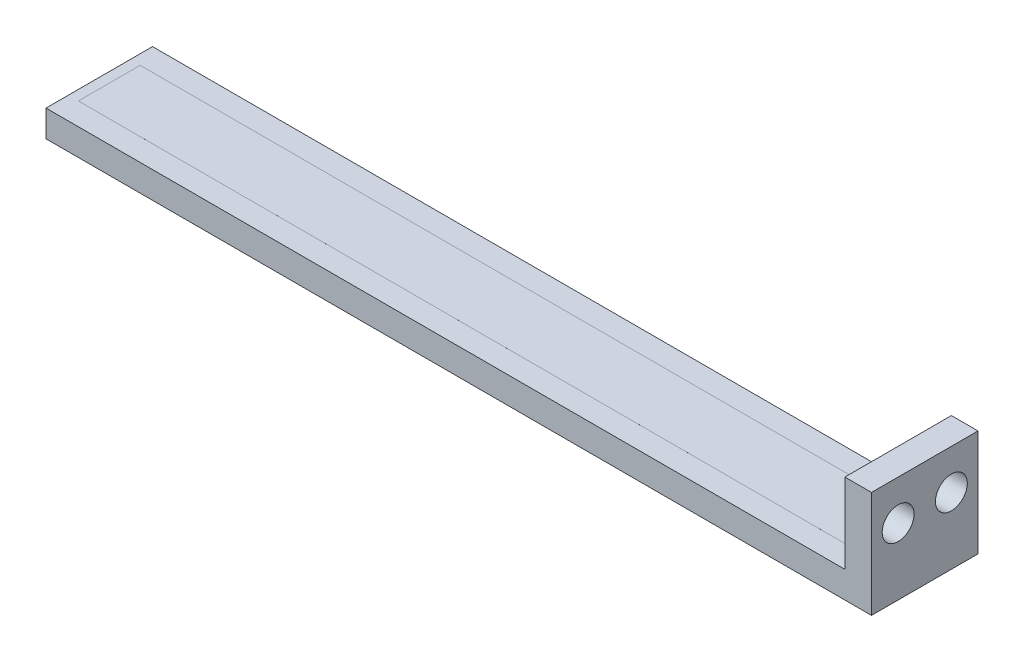
ISO-10303-21;
HEADER;
FILE_DESCRIPTION(('STEP AP214'),'2;1');
FILE_NAME('part.step','',(''),(''),'','','');
FILE_SCHEMA(('AUTOMOTIVE_DESIGN { 1 0 10303 214 1 1 1 1 }'));
ENDSEC;
DATA;
#1=APPLICATION_CONTEXT('core data for automotive mechanical design processes');
#2=APPLICATION_PROTOCOL_DEFINITION('international standard','automotive_design',2000,#1);
#3=PRODUCT_CONTEXT('',#1,'mechanical');
#4=PRODUCT('Part','Part','',(#3));
#5=PRODUCT_RELATED_PRODUCT_CATEGORY('part','',(#4));
#6=PRODUCT_DEFINITION_FORMATION('','',#4);
#7=PRODUCT_DEFINITION_CONTEXT('part definition',#1,'design');
#8=PRODUCT_DEFINITION('design','',#6,#7);
#9=PRODUCT_DEFINITION_SHAPE('','',#8);
#10=(LENGTH_UNIT() NAMED_UNIT(*) SI_UNIT(.MILLI.,.METRE.));
#11=(NAMED_UNIT(*) PLANE_ANGLE_UNIT() SI_UNIT($,.RADIAN.));
#12=(NAMED_UNIT(*) SI_UNIT($,.STERADIAN.) SOLID_ANGLE_UNIT());
#13=UNCERTAINTY_MEASURE_WITH_UNIT(LENGTH_MEASURE(1.E-05),#10,'distance_accuracy_value','');
#14=(GEOMETRIC_REPRESENTATION_CONTEXT(3) GLOBAL_UNCERTAINTY_ASSIGNED_CONTEXT((#13)) GLOBAL_UNIT_ASSIGNED_CONTEXT((#10,
#11,#12)) REPRESENTATION_CONTEXT('',''));
#15=CARTESIAN_POINT('',(0.,0.,0.));
#16=DIRECTION('',(0.,0.,1.));
#17=DIRECTION('',(1.,0.,0.));
#18=AXIS2_PLACEMENT_3D('',#15,#16,#17);
#19=CARTESIAN_POINT('',(0.,1.5875,12.7));
#20=DIRECTION('',(0.,-1.,0.));
#21=DIRECTION('',(1.,0.,0.));
#22=AXIS2_PLACEMENT_3D('',#19,#20,#21);
#23=PLANE('',#22);
#24=DIRECTION('',(-1.,0.,0.));
#25=VECTOR('',#24,1.);
#26=CARTESIAN_POINT('',(0.,1.5875,0.));
#27=LINE('',#26,#25);
#28=CARTESIAN_POINT('',(47.625,1.58750000000001,0.));
#29=VERTEX_POINT('',#28);
#30=CARTESIAN_POINT('',(-47.625,1.58749999999999,0.));
#31=VERTEX_POINT('',#30);
#32=EDGE_CURVE('E152',#29,#31,#27,.T.);
#33=ORIENTED_EDGE('',*,*,#32,.T.);
#34=DIRECTION('',(0.,0.,-1.));
#35=VECTOR('',#34,1.);
#36=CARTESIAN_POINT('',(-47.625,1.58749999999999,12.7));
#37=LINE('',#36,#35);
#38=CARTESIAN_POINT('',(-47.625,1.58749999999999,12.7));
#39=VERTEX_POINT('',#38);
#40=EDGE_CURVE('E165',#39,#31,#37,.T.);
#41=ORIENTED_EDGE('',*,*,#40,.F.);
#42=DIRECTION('',(-1.,0.,0.));
#43=VECTOR('',#42,1.);
#44=CARTESIAN_POINT('',(0.,1.5875,12.7));
#45=LINE('',#44,#43);
#46=CARTESIAN_POINT('',(47.625,1.58750000000001,12.7));
#47=VERTEX_POINT('',#46);
#48=EDGE_CURVE('E163',#47,#39,#45,.T.);
#49=ORIENTED_EDGE('',*,*,#48,.F.);
#50=DIRECTION('',(0.,0.,-1.));
#51=VECTOR('',#50,1.);
#52=CARTESIAN_POINT('',(47.625,1.58750000000001,12.7));
#53=LINE('',#52,#51);
#54=EDGE_CURVE('E183',#47,#29,#53,.T.);
#55=ORIENTED_EDGE('',*,*,#54,.T.);
#56=EDGE_LOOP('',(#33,#41,#49,#55));
#57=FACE_BOUND('',#56,.T.);
#58=DIRECTION('',(0.,0.,1.));
#59=VECTOR('',#58,1.);
#60=CARTESIAN_POINT('',(-46.4285533627469,1.58749999999999,10.0319032515552));
#61=LINE('',#60,#59);
#62=CARTESIAN_POINT('',(-46.4285533627469,1.58749999999999,2.66809674844484));
#63=VERTEX_POINT('',#62);
#64=CARTESIAN_POINT('',(-46.4285533627469,1.58749999999999,10.0319032515552));
#65=VERTEX_POINT('',#64);
#66=EDGE_CURVE('E129',#63,#65,#61,.T.);
#67=ORIENTED_EDGE('',*,*,#66,.F.);
#68=DIRECTION('',(-1.,0.,0.));
#69=VECTOR('',#68,1.);
#70=CARTESIAN_POINT('',(46.4285533627469,1.58750000000001,2.66809674844484));
#71=LINE('',#70,#69);
#72=CARTESIAN_POINT('',(46.4285533627469,1.58750000000001,2.66809674844484));
#73=VERTEX_POINT('',#72);
#74=EDGE_CURVE('E126',#73,#63,#71,.T.);
#75=ORIENTED_EDGE('',*,*,#74,.F.);
#76=DIRECTION('',(0.,0.,-1.));
#77=VECTOR('',#76,1.);
#78=CARTESIAN_POINT('',(46.4285533627469,1.58750000000001,10.0319032515552));
#79=LINE('',#78,#77);
#80=CARTESIAN_POINT('',(46.4285533627469,1.58750000000001,10.0319032515552));
#81=VERTEX_POINT('',#80);
#82=EDGE_CURVE('E53',#81,#73,#79,.T.);
#83=ORIENTED_EDGE('',*,*,#82,.F.);
#84=DIRECTION('',(1.,0.,0.));
#85=VECTOR('',#84,1.);
#86=CARTESIAN_POINT('',(46.4285533627469,1.58750000000001,10.0319032515552));
#87=LINE('',#86,#85);
#88=EDGE_CURVE('E48',#65,#81,#87,.T.);
#89=ORIENTED_EDGE('',*,*,#88,.F.);
#90=EDGE_LOOP('',(#67,#75,#83,#89));
#91=FACE_BOUND('',#90,.T.);
#92=ADVANCED_FACE('F33',(#57,#91),#23,.F.);
#93=CARTESIAN_POINT('',(-47.625,0.,12.7));
#94=DIRECTION('',(-1.,0.,0.));
#95=DIRECTION('',(0.,0.,1.));
#96=AXIS2_PLACEMENT_3D('',#93,#94,#95);
#97=PLANE('',#96);
#98=DIRECTION('',(0.,1.,0.));
#99=VECTOR('',#98,1.);
#100=CARTESIAN_POINT('',(-47.625,0.,0.));
#101=LINE('',#100,#99);
#102=CARTESIAN_POINT('',(-47.625,-1.58750000000001,0.));
#103=VERTEX_POINT('',#102);
#104=EDGE_CURVE('E147',#103,#31,#101,.T.);
#105=ORIENTED_EDGE('',*,*,#104,.F.);
#106=DIRECTION('',(0.,0.,-1.));
#107=VECTOR('',#106,1.);
#108=CARTESIAN_POINT('',(-47.625,-1.58750000000001,12.7));
#109=LINE('',#108,#107);
#110=CARTESIAN_POINT('',(-47.625,-1.58750000000001,12.7));
#111=VERTEX_POINT('',#110);
#112=EDGE_CURVE('E11',#111,#103,#109,.T.);
#113=ORIENTED_EDGE('',*,*,#112,.F.);
#114=DIRECTION('',(0.,1.,0.));
#115=VECTOR('',#114,1.);
#116=CARTESIAN_POINT('',(-47.625,0.,12.7));
#117=LINE('',#116,#115);
#118=EDGE_CURVE('E148',#111,#39,#117,.T.);
#119=ORIENTED_EDGE('',*,*,#118,.T.);
#120=ORIENTED_EDGE('',*,*,#40,.T.);
#121=EDGE_LOOP('',(#105,#113,#119,#120));
#122=FACE_BOUND('',#121,.T.);
#123=ADVANCED_FACE('F35',(#122),#97,.T.);
#124=CARTESIAN_POINT('',(0.,-1.5875,12.7));
#125=DIRECTION('',(0.,-1.,0.));
#126=DIRECTION('',(1.,0.,0.));
#127=AXIS2_PLACEMENT_3D('',#124,#125,#126);
#128=PLANE('',#127);
#129=DIRECTION('',(-1.,0.,0.));
#130=VECTOR('',#129,1.);
#131=CARTESIAN_POINT('',(0.,-1.5875,0.));
#132=LINE('',#131,#130);
#133=CARTESIAN_POINT('',(50.8,-1.58749999999999,0.));
#134=VERTEX_POINT('',#133);
#135=EDGE_CURVE('E168',#134,#103,#132,.T.);
#136=ORIENTED_EDGE('',*,*,#135,.F.);
#137=DIRECTION('',(0.,0.,-1.));
#138=VECTOR('',#137,1.);
#139=CARTESIAN_POINT('',(50.8,-1.58749999999999,12.7));
#140=LINE('',#139,#138);
#141=CARTESIAN_POINT('',(50.8,-1.58749999999999,12.7));
#142=VERTEX_POINT('',#141);
#143=EDGE_CURVE('E41',#142,#134,#140,.T.);
#144=ORIENTED_EDGE('',*,*,#143,.F.);
#145=DIRECTION('',(-1.,0.,0.));
#146=VECTOR('',#145,1.);
#147=CARTESIAN_POINT('',(0.,-1.5875,12.7));
#148=LINE('',#147,#146);
#149=EDGE_CURVE('E151',#142,#111,#148,.T.);
#150=ORIENTED_EDGE('',*,*,#149,.T.);
#151=ORIENTED_EDGE('',*,*,#112,.T.);
#152=EDGE_LOOP('',(#136,#144,#150,#151));
#153=FACE_BOUND('',#152,.T.);
#154=ADVANCED_FACE('F199',(#153),#128,.T.);
#155=CARTESIAN_POINT('',(50.8,0.,12.7));
#156=DIRECTION('',(-1.,0.,0.));
#157=DIRECTION('',(0.,0.,1.));
#158=AXIS2_PLACEMENT_3D('',#155,#156,#157);
#159=PLANE('',#158);
#160=CARTESIAN_POINT('',(50.8,6.35000000000001,9.525));
#161=DIRECTION('',(-1.,0.,0.));
#162=DIRECTION('',(0.,0.,1.));
#163=AXIS2_PLACEMENT_3D('',#160,#161,#162);
#164=CIRCLE('',#163,1.89865);
#165=CARTESIAN_POINT('',(50.8,6.35000000000001,11.42365));
#166=VERTEX_POINT('',#165);
#167=EDGE_CURVE('E133',#166,#166,#164,.T.);
#168=ORIENTED_EDGE('',*,*,#167,.T.);
#169=EDGE_LOOP('',(#168));
#170=FACE_BOUND('',#169,.T.);
#171=CARTESIAN_POINT('',(50.8,6.35000000000001,3.175));
#172=DIRECTION('',(-1.,0.,0.));
#173=DIRECTION('',(0.,0.,1.));
#174=AXIS2_PLACEMENT_3D('',#171,#172,#173);
#175=CIRCLE('',#174,1.89865);
#176=CARTESIAN_POINT('',(50.8,6.35000000000001,5.07365));
#177=VERTEX_POINT('',#176);
#178=EDGE_CURVE('E144',#177,#177,#175,.T.);
#179=ORIENTED_EDGE('',*,*,#178,.T.);
#180=EDGE_LOOP('',(#179));
#181=FACE_BOUND('',#180,.T.);
#182=DIRECTION('',(0.,1.,0.));
#183=VECTOR('',#182,1.);
#184=CARTESIAN_POINT('',(50.8,0.,0.));
#185=LINE('',#184,#183);
#186=CARTESIAN_POINT('',(50.8,11.1125,0.));
#187=VERTEX_POINT('',#186);
#188=EDGE_CURVE('E171',#134,#187,#185,.T.);
#189=ORIENTED_EDGE('',*,*,#188,.T.);
#190=DIRECTION('',(0.,0.,-1.));
#191=VECTOR('',#190,1.);
#192=CARTESIAN_POINT('',(50.8,11.1125,12.7));
#193=LINE('',#192,#191);
#194=CARTESIAN_POINT('',(50.8,11.1125,12.7));
#195=VERTEX_POINT('',#194);
#196=EDGE_CURVE('E187',#195,#187,#193,.T.);
#197=ORIENTED_EDGE('',*,*,#196,.F.);
#198=DIRECTION('',(0.,1.,0.));
#199=VECTOR('',#198,1.);
#200=CARTESIAN_POINT('',(50.8,0.,12.7));
#201=LINE('',#200,#199);
#202=EDGE_CURVE('E155',#142,#195,#201,.T.);
#203=ORIENTED_EDGE('',*,*,#202,.F.);
#204=ORIENTED_EDGE('',*,*,#143,.T.);
#205=EDGE_LOOP('',(#189,#197,#203,#204));
#206=FACE_BOUND('',#205,.T.);
#207=ADVANCED_FACE('F191',(#170,#181,#206),#159,.F.);
#208=CARTESIAN_POINT('',(0.,11.1125,12.7));
#209=DIRECTION('',(0.,1.,0.));
#210=DIRECTION('',(0.,0.,1.));
#211=AXIS2_PLACEMENT_3D('',#208,#209,#210);
#212=PLANE('',#211);
#213=DIRECTION('',(1.,0.,0.));
#214=VECTOR('',#213,1.);
#215=CARTESIAN_POINT('',(0.,11.1125,0.));
#216=LINE('',#215,#214);
#217=CARTESIAN_POINT('',(47.625,11.1125,0.));
#218=VERTEX_POINT('',#217);
#219=EDGE_CURVE('E174',#218,#187,#216,.T.);
#220=ORIENTED_EDGE('',*,*,#219,.F.);
#221=DIRECTION('',(0.,0.,-1.));
#222=VECTOR('',#221,1.);
#223=CARTESIAN_POINT('',(47.625,11.1125,12.7));
#224=LINE('',#223,#222);
#225=CARTESIAN_POINT('',(47.625,11.1125,12.7));
#226=VERTEX_POINT('',#225);
#227=EDGE_CURVE('E185',#226,#218,#224,.T.);
#228=ORIENTED_EDGE('',*,*,#227,.F.);
#229=DIRECTION('',(1.,0.,0.));
#230=VECTOR('',#229,1.);
#231=CARTESIAN_POINT('',(0.,11.1125,12.7));
#232=LINE('',#231,#230);
#233=EDGE_CURVE('E157',#226,#195,#232,.T.);
#234=ORIENTED_EDGE('',*,*,#233,.T.);
#235=ORIENTED_EDGE('',*,*,#196,.T.);
#236=EDGE_LOOP('',(#220,#228,#234,#235));
#237=FACE_BOUND('',#236,.T.);
#238=ADVANCED_FACE('F213',(#237),#212,.T.);
#239=CARTESIAN_POINT('',(47.625,0.,12.7));
#240=DIRECTION('',(-1.,0.,0.));
#241=DIRECTION('',(0.,0.,1.));
#242=AXIS2_PLACEMENT_3D('',#239,#240,#241);
#243=PLANE('',#242);
#244=CARTESIAN_POINT('',(47.625,6.35000000000001,9.525));
#245=DIRECTION('',(-1.,0.,0.));
#246=DIRECTION('',(0.,0.,1.));
#247=AXIS2_PLACEMENT_3D('',#244,#245,#246);
#248=CIRCLE('',#247,1.89865);
#249=CARTESIAN_POINT('',(47.625,6.35000000000001,11.42365));
#250=VERTEX_POINT('',#249);
#251=EDGE_CURVE('E130',#250,#250,#248,.T.);
#252=ORIENTED_EDGE('',*,*,#251,.F.);
#253=EDGE_LOOP('',(#252));
#254=FACE_BOUND('',#253,.T.);
#255=CARTESIAN_POINT('',(47.625,6.35000000000001,3.175));
#256=DIRECTION('',(-1.,0.,0.));
#257=DIRECTION('',(0.,0.,1.));
#258=AXIS2_PLACEMENT_3D('',#255,#256,#257);
#259=CIRCLE('',#258,1.89865);
#260=CARTESIAN_POINT('',(47.625,6.35000000000001,5.07365));
#261=VERTEX_POINT('',#260);
#262=EDGE_CURVE('E141',#261,#261,#259,.T.);
#263=ORIENTED_EDGE('',*,*,#262,.F.);
#264=EDGE_LOOP('',(#263));
#265=FACE_BOUND('',#264,.T.);
#266=DIRECTION('',(0.,1.,0.));
#267=VECTOR('',#266,1.);
#268=CARTESIAN_POINT('',(47.625,0.,0.));
#269=LINE('',#268,#267);
#270=EDGE_CURVE('E177',#29,#218,#269,.T.);
#271=ORIENTED_EDGE('',*,*,#270,.F.);
#272=ORIENTED_EDGE('',*,*,#54,.F.);
#273=DIRECTION('',(0.,1.,0.));
#274=VECTOR('',#273,1.);
#275=CARTESIAN_POINT('',(47.625,0.,12.7));
#276=LINE('',#275,#274);
#277=EDGE_CURVE('E160',#47,#226,#276,.T.);
#278=ORIENTED_EDGE('',*,*,#277,.T.);
#279=ORIENTED_EDGE('',*,*,#227,.T.);
#280=EDGE_LOOP('',(#271,#272,#278,#279));
#281=FACE_BOUND('',#280,.T.);
#282=ADVANCED_FACE('F208',(#254,#265,#281),#243,.T.);
#283=CARTESIAN_POINT('',(0.,0.,12.7));
#284=DIRECTION('',(0.,0.,1.));
#285=DIRECTION('',(1.,0.,0.));
#286=AXIS2_PLACEMENT_3D('',#283,#284,#285);
#287=PLANE('',#286);
#288=ORIENTED_EDGE('',*,*,#118,.F.);
#289=ORIENTED_EDGE('',*,*,#149,.F.);
#290=ORIENTED_EDGE('',*,*,#202,.T.);
#291=ORIENTED_EDGE('',*,*,#233,.F.);
#292=ORIENTED_EDGE('',*,*,#277,.F.);
#293=ORIENTED_EDGE('',*,*,#48,.T.);
#294=EDGE_LOOP('',(#288,#289,#290,#291,#292,#293));
#295=FACE_BOUND('',#294,.T.);
#296=ADVANCED_FACE('F215',(#295),#287,.T.);
#297=CARTESIAN_POINT('',(0.,0.,0.));
#298=DIRECTION('',(0.,0.,1.));
#299=DIRECTION('',(1.,0.,0.));
#300=AXIS2_PLACEMENT_3D('',#297,#298,#299);
#301=PLANE('',#300);
#302=ORIENTED_EDGE('',*,*,#104,.T.);
#303=ORIENTED_EDGE('',*,*,#32,.F.);
#304=ORIENTED_EDGE('',*,*,#270,.T.);
#305=ORIENTED_EDGE('',*,*,#219,.T.);
#306=ORIENTED_EDGE('',*,*,#188,.F.);
#307=ORIENTED_EDGE('',*,*,#135,.T.);
#308=EDGE_LOOP('',(#302,#303,#304,#305,#306,#307));
#309=FACE_BOUND('',#308,.T.);
#310=ADVANCED_FACE('F197',(#309),#301,.F.);
#311=CARTESIAN_POINT('',(60.325,6.35000000000001,3.175));
#312=DIRECTION('',(-1.,0.,0.));
#313=DIRECTION('',(0.,0.,1.));
#314=AXIS2_PLACEMENT_3D('',#311,#312,#313);
#315=CYLINDRICAL_SURFACE('',#314,1.89865);
#316=ORIENTED_EDGE('',*,*,#262,.T.);
#317=EDGE_LOOP('',(#316));
#318=FACE_BOUND('',#317,.T.);
#319=ORIENTED_EDGE('',*,*,#178,.F.);
#320=EDGE_LOOP('',(#319));
#321=FACE_BOUND('',#320,.T.);
#322=ADVANCED_FACE('F248',(#318,#321),#315,.F.);
#323=CARTESIAN_POINT('',(60.325,6.35000000000001,9.525));
#324=DIRECTION('',(-1.,0.,0.));
#325=DIRECTION('',(0.,0.,1.));
#326=AXIS2_PLACEMENT_3D('',#323,#324,#325);
#327=CYLINDRICAL_SURFACE('',#326,1.89865);
#328=ORIENTED_EDGE('',*,*,#251,.T.);
#329=EDGE_LOOP('',(#328));
#330=FACE_BOUND('',#329,.T.);
#331=ORIENTED_EDGE('',*,*,#167,.F.);
#332=EDGE_LOOP('',(#331));
#333=FACE_BOUND('',#332,.T.);
#334=ADVANCED_FACE('F245',(#330,#333),#327,.F.);
#335=CARTESIAN_POINT('',(-46.4285533627469,1.58775399999999,10.0319032515552));
#336=DIRECTION('',(1.,0.,0.));
#337=DIRECTION('',(0.,1.,0.));
#338=AXIS2_PLACEMENT_3D('',#335,#336,#337);
#339=PLANE('',#338);
#340=ORIENTED_EDGE('',*,*,#66,.T.);
#341=DIRECTION('',(0.,-1.,0.));
#342=VECTOR('',#341,1.);
#343=CARTESIAN_POINT('',(-46.4285533627469,1.58775399999999,10.0319032515552));
#344=LINE('',#343,#342);
#345=CARTESIAN_POINT('',(-46.4285533627469,1.58775399999999,10.0319032515552));
#346=VERTEX_POINT('',#345);
#347=EDGE_CURVE('E110',#346,#65,#344,.T.);
#348=ORIENTED_EDGE('',*,*,#347,.F.);
#349=DIRECTION('',(0.,0.,1.));
#350=VECTOR('',#349,1.);
#351=CARTESIAN_POINT('',(-46.4285533627469,1.58775399999999,10.0319032515552));
#352=LINE('',#351,#350);
#353=CARTESIAN_POINT('',(-46.4285533627469,1.58775399999999,2.66809674844484));
#354=VERTEX_POINT('',#353);
#355=EDGE_CURVE('E117',#354,#346,#352,.T.);
#356=ORIENTED_EDGE('',*,*,#355,.F.);
#357=DIRECTION('',(0.,-1.,0.));
#358=VECTOR('',#357,1.);
#359=CARTESIAN_POINT('',(-46.4285533627469,1.58775399999999,2.66809674844484));
#360=LINE('',#359,#358);
#361=EDGE_CURVE('E223',#354,#63,#360,.T.);
#362=ORIENTED_EDGE('',*,*,#361,.T.);
#363=EDGE_LOOP('',(#340,#348,#356,#362));
#364=FACE_BOUND('',#363,.T.);
#365=ADVANCED_FACE('F128',(#364),#339,.F.);
#366=CARTESIAN_POINT('',(46.4285533627469,1.58775400000001,10.0319032515552));
#367=DIRECTION('',(0.,0.,-1.));
#368=DIRECTION('',(-1.,0.,0.));
#369=AXIS2_PLACEMENT_3D('',#366,#367,#368);
#370=PLANE('',#369);
#371=ORIENTED_EDGE('',*,*,#88,.T.);
#372=DIRECTION('',(0.,-1.,0.));
#373=VECTOR('',#372,1.);
#374=CARTESIAN_POINT('',(46.4285533627469,1.58775400000001,10.0319032515552));
#375=LINE('',#374,#373);
#376=CARTESIAN_POINT('',(46.4285533627469,1.58775400000001,10.0319032515552));
#377=VERTEX_POINT('',#376);
#378=EDGE_CURVE('E113',#377,#81,#375,.T.);
#379=ORIENTED_EDGE('',*,*,#378,.F.);
#380=DIRECTION('',(1.,0.,0.));
#381=VECTOR('',#380,1.);
#382=CARTESIAN_POINT('',(46.4285533627469,1.58775400000001,10.0319032515552));
#383=LINE('',#382,#381);
#384=EDGE_CURVE('E106',#346,#377,#383,.T.);
#385=ORIENTED_EDGE('',*,*,#384,.F.);
#386=ORIENTED_EDGE('',*,*,#347,.T.);
#387=EDGE_LOOP('',(#371,#379,#385,#386));
#388=FACE_BOUND('',#387,.T.);
#389=ADVANCED_FACE('F108',(#388),#370,.F.);
#390=CARTESIAN_POINT('',(46.4285533627469,1.58775400000001,10.0319032515552));
#391=DIRECTION('',(-1.,0.,0.));
#392=DIRECTION('',(0.,-1.,0.));
#393=AXIS2_PLACEMENT_3D('',#390,#391,#392);
#394=PLANE('',#393);
#395=ORIENTED_EDGE('',*,*,#82,.T.);
#396=DIRECTION('',(0.,-1.,0.));
#397=VECTOR('',#396,1.);
#398=CARTESIAN_POINT('',(46.4285533627469,1.58775400000001,2.66809674844484));
#399=LINE('',#398,#397);
#400=CARTESIAN_POINT('',(46.4285533627469,1.58775400000001,2.66809674844484));
#401=VERTEX_POINT('',#400);
#402=EDGE_CURVE('E135',#401,#73,#399,.T.);
#403=ORIENTED_EDGE('',*,*,#402,.F.);
#404=DIRECTION('',(0.,0.,-1.));
#405=VECTOR('',#404,1.);
#406=CARTESIAN_POINT('',(46.4285533627469,1.58775400000001,10.0319032515552));
#407=LINE('',#406,#405);
#408=EDGE_CURVE('E116',#377,#401,#407,.T.);
#409=ORIENTED_EDGE('',*,*,#408,.F.);
#410=ORIENTED_EDGE('',*,*,#378,.T.);
#411=EDGE_LOOP('',(#395,#403,#409,#410));
#412=FACE_BOUND('',#411,.T.);
#413=ADVANCED_FACE('F232',(#412),#394,.F.);
#414=CARTESIAN_POINT('',(46.4285533627469,1.58775400000001,2.66809674844484));
#415=DIRECTION('',(0.,0.,1.));
#416=DIRECTION('',(1.,0.,0.));
#417=AXIS2_PLACEMENT_3D('',#414,#415,#416);
#418=PLANE('',#417);
#419=ORIENTED_EDGE('',*,*,#74,.T.);
#420=ORIENTED_EDGE('',*,*,#361,.F.);
#421=DIRECTION('',(-1.,0.,0.));
#422=VECTOR('',#421,1.);
#423=CARTESIAN_POINT('',(46.4285533627469,1.58775400000001,2.66809674844484));
#424=LINE('',#423,#422);
#425=EDGE_CURVE('E122',#401,#354,#424,.T.);
#426=ORIENTED_EDGE('',*,*,#425,.F.);
#427=ORIENTED_EDGE('',*,*,#402,.T.);
#428=EDGE_LOOP('',(#419,#420,#426,#427));
#429=FACE_BOUND('',#428,.T.);
#430=ADVANCED_FACE('F222',(#429),#418,.F.);
#431=CARTESIAN_POINT('',(0.,1.587754,0.));
#432=DIRECTION('',(0.,1.,0.));
#433=DIRECTION('',(-1.,0.,0.));
#434=AXIS2_PLACEMENT_3D('',#431,#432,#433);
#435=PLANE('',#434);
#436=ORIENTED_EDGE('',*,*,#355,.T.);
#437=ORIENTED_EDGE('',*,*,#384,.T.);
#438=ORIENTED_EDGE('',*,*,#408,.T.);
#439=ORIENTED_EDGE('',*,*,#425,.T.);
#440=EDGE_LOOP('',(#436,#437,#438,#439));
#441=FACE_BOUND('',#440,.T.);
#442=ADVANCED_FACE('F120',(#441),#435,.T.);
#443=CLOSED_SHELL('',(#92,#123,#154,#207,#238,#282,#296,#310,#322,#334,#365,#389,#413,#430,#442));
#444=MANIFOLD_SOLID_BREP('B2',#443);
#445=ADVANCED_BREP_SHAPE_REPRESENTATION('',(#18,#444),#14);
#446=SHAPE_DEFINITION_REPRESENTATION(#9,#445);
ENDSEC;
END-ISO-10303-21;
